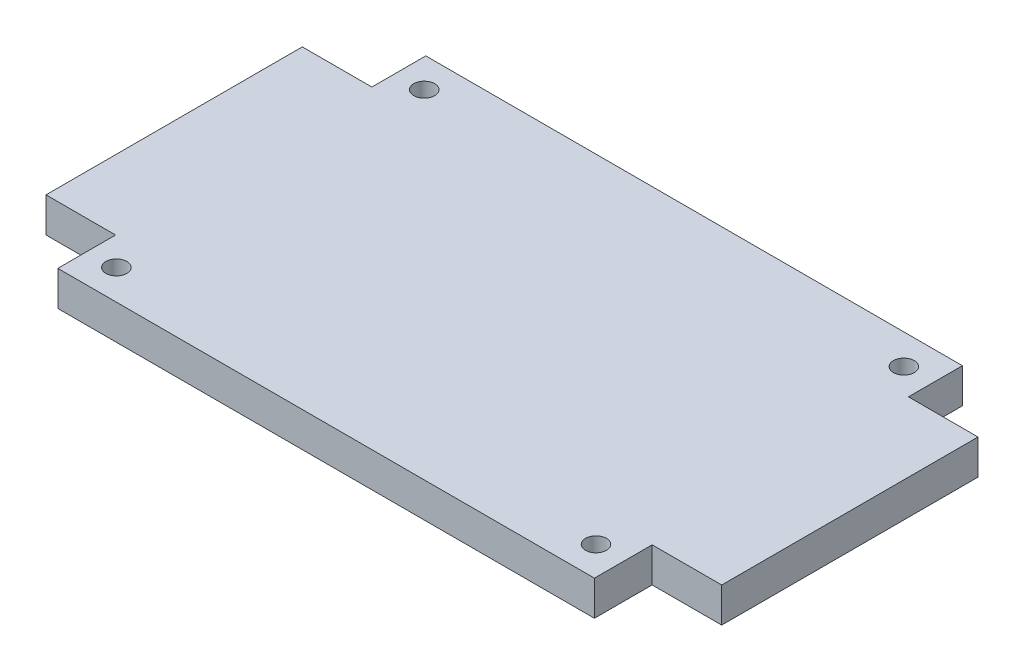
ISO-10303-21;
HEADER;
FILE_DESCRIPTION(('STEP AP214'),'2;1');
FILE_NAME('part.step','',(''),(''),'','','');
FILE_SCHEMA(('AUTOMOTIVE_DESIGN { 1 0 10303 214 1 1 1 1 }'));
ENDSEC;
DATA;
#1=APPLICATION_CONTEXT('core data for automotive mechanical design processes');
#2=APPLICATION_PROTOCOL_DEFINITION('international standard','automotive_design',2000,#1);
#3=PRODUCT_CONTEXT('',#1,'mechanical');
#4=PRODUCT('Part','Part','',(#3));
#5=PRODUCT_RELATED_PRODUCT_CATEGORY('part','',(#4));
#6=PRODUCT_DEFINITION_FORMATION('','',#4);
#7=PRODUCT_DEFINITION_CONTEXT('part definition',#1,'design');
#8=PRODUCT_DEFINITION('design','',#6,#7);
#9=PRODUCT_DEFINITION_SHAPE('','',#8);
#10=(LENGTH_UNIT() NAMED_UNIT(*) SI_UNIT(.MILLI.,.METRE.));
#11=(NAMED_UNIT(*) PLANE_ANGLE_UNIT() SI_UNIT($,.RADIAN.));
#12=(NAMED_UNIT(*) SI_UNIT($,.STERADIAN.) SOLID_ANGLE_UNIT());
#13=UNCERTAINTY_MEASURE_WITH_UNIT(LENGTH_MEASURE(1.E-05),#10,'distance_accuracy_value','');
#14=(GEOMETRIC_REPRESENTATION_CONTEXT(3) GLOBAL_UNCERTAINTY_ASSIGNED_CONTEXT((#13)) GLOBAL_UNIT_ASSIGNED_CONTEXT((#10,
#11,#12)) REPRESENTATION_CONTEXT('',''));
#15=CARTESIAN_POINT('',(0.,0.,0.));
#16=DIRECTION('',(0.,0.,1.));
#17=DIRECTION('',(1.,0.,0.));
#18=AXIS2_PLACEMENT_3D('',#15,#16,#17);
#19=CARTESIAN_POINT('',(38.57,5.,26.45));
#20=DIRECTION('',(-1.,0.,0.));
#21=DIRECTION('',(0.,0.,1.));
#22=AXIS2_PLACEMENT_3D('',#19,#20,#21);
#23=PLANE('',#22);
#24=DIRECTION('',(0.,0.,-1.));
#25=VECTOR('',#24,1.);
#26=CARTESIAN_POINT('',(38.57,5.,26.45));
#27=LINE('',#26,#25);
#28=CARTESIAN_POINT('',(38.57,5.,-18.6946871989676));
#29=VERTEX_POINT('',#28);
#30=CARTESIAN_POINT('',(38.57,5.,-26.45));
#31=VERTEX_POINT('',#30);
#32=EDGE_CURVE('E222',#29,#31,#27,.T.);
#33=ORIENTED_EDGE('',*,*,#32,.F.);
#34=DIRECTION('',(0.,-1.,0.));
#35=VECTOR('',#34,1.);
#36=CARTESIAN_POINT('',(38.57,5.,-18.6946871989676));
#37=LINE('',#36,#35);
#38=CARTESIAN_POINT('',(38.57,0.,-18.6946871989676));
#39=VERTEX_POINT('',#38);
#40=EDGE_CURVE('E138',#29,#39,#37,.T.);
#41=ORIENTED_EDGE('',*,*,#40,.T.);
#42=DIRECTION('',(0.,0.,-1.));
#43=VECTOR('',#42,1.);
#44=CARTESIAN_POINT('',(38.57,0.,26.45));
#45=LINE('',#44,#43);
#46=CARTESIAN_POINT('',(38.57,0.,-26.45));
#47=VERTEX_POINT('',#46);
#48=EDGE_CURVE('E232',#39,#47,#45,.T.);
#49=ORIENTED_EDGE('',*,*,#48,.T.);
#50=DIRECTION('',(0.,-1.,0.));
#51=VECTOR('',#50,1.);
#52=CARTESIAN_POINT('',(38.57,5.,-26.45));
#53=LINE('',#52,#51);
#54=EDGE_CURVE('E240',#31,#47,#53,.T.);
#55=ORIENTED_EDGE('',*,*,#54,.F.);
#56=EDGE_LOOP('',(#33,#41,#49,#55));
#57=FACE_BOUND('',#56,.T.);
#58=ADVANCED_FACE('F41',(#57),#23,.F.);
#59=CARTESIAN_POINT('',(-38.57,5.,26.45));
#60=DIRECTION('',(1.,0.,0.));
#61=DIRECTION('',(0.,0.,-1.));
#62=AXIS2_PLACEMENT_3D('',#59,#60,#61);
#63=PLANE('',#62);
#64=DIRECTION('',(0.,-1.,0.));
#65=VECTOR('',#64,1.);
#66=CARTESIAN_POINT('',(-38.57,5.,-18.6946871989676));
#67=LINE('',#66,#65);
#68=CARTESIAN_POINT('',(-38.57,5.,-18.6946871989676));
#69=VERTEX_POINT('',#68);
#70=CARTESIAN_POINT('',(-38.57,0.,-18.6946871989676));
#71=VERTEX_POINT('',#70);
#72=EDGE_CURVE('E64',#69,#71,#67,.T.);
#73=ORIENTED_EDGE('',*,*,#72,.F.);
#74=DIRECTION('',(0.,0.,1.));
#75=VECTOR('',#74,1.);
#76=CARTESIAN_POINT('',(-38.57,5.,26.45));
#77=LINE('',#76,#75);
#78=CARTESIAN_POINT('',(-38.57,5.,-26.45));
#79=VERTEX_POINT('',#78);
#80=EDGE_CURVE('E217',#79,#69,#77,.T.);
#81=ORIENTED_EDGE('',*,*,#80,.F.);
#82=DIRECTION('',(0.,-1.,0.));
#83=VECTOR('',#82,1.);
#84=CARTESIAN_POINT('',(-38.57,5.,-26.45));
#85=LINE('',#84,#83);
#86=CARTESIAN_POINT('',(-38.57,0.,-26.45));
#87=VERTEX_POINT('',#86);
#88=EDGE_CURVE('E227',#79,#87,#85,.T.);
#89=ORIENTED_EDGE('',*,*,#88,.T.);
#90=DIRECTION('',(0.,0.,1.));
#91=VECTOR('',#90,1.);
#92=CARTESIAN_POINT('',(-38.57,0.,26.45));
#93=LINE('',#92,#91);
#94=EDGE_CURVE('E228',#87,#71,#93,.T.);
#95=ORIENTED_EDGE('',*,*,#94,.T.);
#96=EDGE_LOOP('',(#73,#81,#89,#95));
#97=FACE_BOUND('',#96,.T.);
#98=ADVANCED_FACE('F43',(#97),#63,.F.);
#99=DIRECTION('',(0.,1.,0.));
#100=VECTOR('',#99,1.);
#101=CARTESIAN_POINT('',(-38.57,5.,18.1501817465705));
#102=LINE('',#101,#100);
#103=CARTESIAN_POINT('',(-38.57,0.,18.1501817465705));
#104=VERTEX_POINT('',#103);
#105=CARTESIAN_POINT('',(-38.57,5.,18.1501817465705));
#106=VERTEX_POINT('',#105);
#107=EDGE_CURVE('E171',#104,#106,#102,.T.);
#108=ORIENTED_EDGE('',*,*,#107,.F.);
#109=CARTESIAN_POINT('',(-38.57,0.,26.45));
#110=VERTEX_POINT('',#109);
#111=EDGE_CURVE('E214',#104,#110,#93,.T.);
#112=ORIENTED_EDGE('',*,*,#111,.T.);
#113=DIRECTION('',(0.,-1.,0.));
#114=VECTOR('',#113,1.);
#115=CARTESIAN_POINT('',(-38.57,5.,26.45));
#116=LINE('',#115,#114);
#117=CARTESIAN_POINT('',(-38.57,5.,26.45));
#118=VERTEX_POINT('',#117);
#119=EDGE_CURVE('E11',#118,#110,#116,.T.);
#120=ORIENTED_EDGE('',*,*,#119,.F.);
#121=EDGE_CURVE('E220',#106,#118,#77,.T.);
#122=ORIENTED_EDGE('',*,*,#121,.F.);
#123=EDGE_LOOP('',(#108,#112,#120,#122));
#124=FACE_BOUND('',#123,.T.);
#125=ADVANCED_FACE('F260',(#124),#63,.F.);
#126=CARTESIAN_POINT('',(0.,5.,0.));
#127=DIRECTION('',(0.,1.,0.));
#128=DIRECTION('',(0.,0.,1.));
#129=AXIS2_PLACEMENT_3D('',#126,#127,#128);
#130=PLANE('',#129);
#131=CARTESIAN_POINT('',(-34.475,5.,-22.13));
#132=DIRECTION('',(0.,1.,0.));
#133=DIRECTION('',(0.,0.,1.));
#134=AXIS2_PLACEMENT_3D('',#131,#132,#133);
#135=CIRCLE('',#134,1.5);
#136=CARTESIAN_POINT('',(-34.475,5.,-20.63));
#137=VERTEX_POINT('',#136);
#138=EDGE_CURVE('E199',#137,#137,#135,.T.);
#139=ORIENTED_EDGE('',*,*,#138,.F.);
#140=EDGE_LOOP('',(#139));
#141=FACE_BOUND('',#140,.T.);
#142=CARTESIAN_POINT('',(34.475,5.,22.13));
#143=DIRECTION('',(0.,1.,0.));
#144=DIRECTION('',(0.,0.,1.));
#145=AXIS2_PLACEMENT_3D('',#142,#143,#144);
#146=CIRCLE('',#145,1.5);
#147=CARTESIAN_POINT('',(34.475,5.,23.63));
#148=VERTEX_POINT('',#147);
#149=EDGE_CURVE('E211',#148,#148,#146,.T.);
#150=ORIENTED_EDGE('',*,*,#149,.F.);
#151=EDGE_LOOP('',(#150));
#152=FACE_BOUND('',#151,.T.);
#153=ORIENTED_EDGE('',*,*,#80,.T.);
#154=DIRECTION('',(1.,0.,0.));
#155=VECTOR('',#154,1.);
#156=CARTESIAN_POINT('',(-48.57,5.,-18.6946871989676));
#157=LINE('',#156,#155);
#158=CARTESIAN_POINT('',(-48.57,5.,-18.6946871989676));
#159=VERTEX_POINT('',#158);
#160=EDGE_CURVE('E177',#159,#69,#157,.T.);
#161=ORIENTED_EDGE('',*,*,#160,.F.);
#162=DIRECTION('',(0.,0.,-1.));
#163=VECTOR('',#162,1.);
#164=CARTESIAN_POINT('',(-48.57,5.,-18.6946871989676));
#165=LINE('',#164,#163);
#166=CARTESIAN_POINT('',(-48.57,5.,18.1501817465705));
#167=VERTEX_POINT('',#166);
#168=EDGE_CURVE('E175',#167,#159,#165,.T.);
#169=ORIENTED_EDGE('',*,*,#168,.F.);
#170=DIRECTION('',(1.,0.,0.));
#171=VECTOR('',#170,1.);
#172=CARTESIAN_POINT('',(-48.57,5.,18.1501817465705));
#173=LINE('',#172,#171);
#174=EDGE_CURVE('E183',#167,#106,#173,.T.);
#175=ORIENTED_EDGE('',*,*,#174,.T.);
#176=ORIENTED_EDGE('',*,*,#121,.T.);
#177=DIRECTION('',(1.,0.,0.));
#178=VECTOR('',#177,1.);
#179=CARTESIAN_POINT('',(38.57,5.,26.45));
#180=LINE('',#179,#178);
#181=CARTESIAN_POINT('',(38.57,5.,26.45));
#182=VERTEX_POINT('',#181);
#183=EDGE_CURVE('E219',#118,#182,#180,.T.);
#184=ORIENTED_EDGE('',*,*,#183,.T.);
#185=CARTESIAN_POINT('',(38.57,5.,18.1501817465705));
#186=VERTEX_POINT('',#185);
#187=EDGE_CURVE('E223',#182,#186,#27,.T.);
#188=ORIENTED_EDGE('',*,*,#187,.T.);
#189=DIRECTION('',(-1.,0.,0.));
#190=VECTOR('',#189,1.);
#191=CARTESIAN_POINT('',(48.57,5.,18.1501817465705));
#192=LINE('',#191,#190);
#193=CARTESIAN_POINT('',(48.57,5.,18.1501817465705));
#194=VERTEX_POINT('',#193);
#195=EDGE_CURVE('E56',#194,#186,#192,.T.);
#196=ORIENTED_EDGE('',*,*,#195,.F.);
#197=DIRECTION('',(0.,0.,-1.));
#198=VECTOR('',#197,1.);
#199=CARTESIAN_POINT('',(48.57,5.,-18.6946871989676));
#200=LINE('',#199,#198);
#201=CARTESIAN_POINT('',(48.57,5.,-18.6946871989676));
#202=VERTEX_POINT('',#201);
#203=EDGE_CURVE('E147',#194,#202,#200,.T.);
#204=ORIENTED_EDGE('',*,*,#203,.T.);
#205=DIRECTION('',(-1.,0.,0.));
#206=VECTOR('',#205,1.);
#207=CARTESIAN_POINT('',(48.57,5.,-18.6946871989676));
#208=LINE('',#207,#206);
#209=EDGE_CURVE('E132',#202,#29,#208,.T.);
#210=ORIENTED_EDGE('',*,*,#209,.T.);
#211=ORIENTED_EDGE('',*,*,#32,.T.);
#212=DIRECTION('',(-1.,0.,0.));
#213=VECTOR('',#212,1.);
#214=CARTESIAN_POINT('',(38.57,5.,-26.45));
#215=LINE('',#214,#213);
#216=EDGE_CURVE('E225',#31,#79,#215,.T.);
#217=ORIENTED_EDGE('',*,*,#216,.T.);
#218=EDGE_LOOP('',(#153,#161,#169,#175,#176,#184,#188,#196,#204,#210,#211,#217));
#219=FACE_BOUND('',#218,.T.);
#220=CARTESIAN_POINT('',(34.475,5.,-22.13));
#221=DIRECTION('',(0.,1.,0.));
#222=DIRECTION('',(0.,0.,1.));
#223=AXIS2_PLACEMENT_3D('',#220,#221,#222);
#224=CIRCLE('',#223,1.5);
#225=CARTESIAN_POINT('',(34.475,5.,-20.63));
#226=VERTEX_POINT('',#225);
#227=EDGE_CURVE('E205',#226,#226,#224,.T.);
#228=ORIENTED_EDGE('',*,*,#227,.F.);
#229=EDGE_LOOP('',(#228));
#230=FACE_BOUND('',#229,.T.);
#231=CARTESIAN_POINT('',(-34.475,5.,22.13));
#232=DIRECTION('',(0.,1.,0.));
#233=DIRECTION('',(0.,0.,1.));
#234=AXIS2_PLACEMENT_3D('',#231,#232,#233);
#235=CIRCLE('',#234,1.5);
#236=CARTESIAN_POINT('',(-34.475,5.,23.63));
#237=VERTEX_POINT('',#236);
#238=EDGE_CURVE('E193',#237,#237,#235,.T.);
#239=ORIENTED_EDGE('',*,*,#238,.F.);
#240=EDGE_LOOP('',(#239));
#241=FACE_BOUND('',#240,.T.);
#242=ADVANCED_FACE('F152',(#141,#152,#219,#230,#241),#130,.T.);
#243=CARTESIAN_POINT('',(0.,0.,0.));
#244=DIRECTION('',(0.,1.,0.));
#245=DIRECTION('',(0.,0.,1.));
#246=AXIS2_PLACEMENT_3D('',#243,#244,#245);
#247=PLANE('',#246);
#248=ORIENTED_EDGE('',*,*,#94,.F.);
#249=DIRECTION('',(-1.,0.,0.));
#250=VECTOR('',#249,1.);
#251=CARTESIAN_POINT('',(38.57,0.,-26.45));
#252=LINE('',#251,#250);
#253=EDGE_CURVE('E236',#47,#87,#252,.T.);
#254=ORIENTED_EDGE('',*,*,#253,.F.);
#255=ORIENTED_EDGE('',*,*,#48,.F.);
#256=DIRECTION('',(-1.,0.,0.));
#257=VECTOR('',#256,1.);
#258=CARTESIAN_POINT('',(48.57,0.,-18.6946871989676));
#259=LINE('',#258,#257);
#260=CARTESIAN_POINT('',(48.57,0.,-18.6946871989676));
#261=VERTEX_POINT('',#260);
#262=EDGE_CURVE('E160',#261,#39,#259,.T.);
#263=ORIENTED_EDGE('',*,*,#262,.F.);
#264=DIRECTION('',(0.,0.,1.));
#265=VECTOR('',#264,1.);
#266=CARTESIAN_POINT('',(48.57,0.,-18.6946871989676));
#267=LINE('',#266,#265);
#268=CARTESIAN_POINT('',(48.57,0.,18.1501817465705));
#269=VERTEX_POINT('',#268);
#270=EDGE_CURVE('E149',#261,#269,#267,.T.);
#271=ORIENTED_EDGE('',*,*,#270,.T.);
#272=DIRECTION('',(-1.,0.,0.));
#273=VECTOR('',#272,1.);
#274=CARTESIAN_POINT('',(48.57,0.,18.1501817465705));
#275=LINE('',#274,#273);
#276=CARTESIAN_POINT('',(38.57,0.,18.1501817465705));
#277=VERTEX_POINT('',#276);
#278=EDGE_CURVE('E164',#269,#277,#275,.T.);
#279=ORIENTED_EDGE('',*,*,#278,.T.);
#280=CARTESIAN_POINT('',(38.57,0.,26.45));
#281=VERTEX_POINT('',#280);
#282=EDGE_CURVE('E233',#281,#277,#45,.T.);
#283=ORIENTED_EDGE('',*,*,#282,.F.);
#284=DIRECTION('',(1.,0.,0.));
#285=VECTOR('',#284,1.);
#286=CARTESIAN_POINT('',(38.57,0.,26.45));
#287=LINE('',#286,#285);
#288=EDGE_CURVE('E230',#110,#281,#287,.T.);
#289=ORIENTED_EDGE('',*,*,#288,.F.);
#290=ORIENTED_EDGE('',*,*,#111,.F.);
#291=DIRECTION('',(1.,0.,0.));
#292=VECTOR('',#291,1.);
#293=CARTESIAN_POINT('',(-48.57,0.,18.1501817465705));
#294=LINE('',#293,#292);
#295=CARTESIAN_POINT('',(-48.57,0.,18.1501817465705));
#296=VERTEX_POINT('',#295);
#297=EDGE_CURVE('E186',#296,#104,#294,.T.);
#298=ORIENTED_EDGE('',*,*,#297,.F.);
#299=DIRECTION('',(0.,0.,1.));
#300=VECTOR('',#299,1.);
#301=CARTESIAN_POINT('',(-48.57,0.,-18.6946871989676));
#302=LINE('',#301,#300);
#303=CARTESIAN_POINT('',(-48.57,0.,-18.6946871989676));
#304=VERTEX_POINT('',#303);
#305=EDGE_CURVE('E170',#304,#296,#302,.T.);
#306=ORIENTED_EDGE('',*,*,#305,.F.);
#307=DIRECTION('',(1.,0.,0.));
#308=VECTOR('',#307,1.);
#309=CARTESIAN_POINT('',(-48.57,0.,-18.6946871989676));
#310=LINE('',#309,#308);
#311=EDGE_CURVE('E189',#304,#71,#310,.T.);
#312=ORIENTED_EDGE('',*,*,#311,.T.);
#313=EDGE_LOOP('',(#248,#254,#255,#263,#271,#279,#283,#289,#290,#298,#306,#312));
#314=FACE_BOUND('',#313,.T.);
#315=CARTESIAN_POINT('',(34.475,0.,22.13));
#316=DIRECTION('',(0.,1.,0.));
#317=DIRECTION('',(0.,0.,1.));
#318=AXIS2_PLACEMENT_3D('',#315,#316,#317);
#319=CIRCLE('',#318,1.5);
#320=CARTESIAN_POINT('',(34.475,0.,23.63));
#321=VERTEX_POINT('',#320);
#322=EDGE_CURVE('E208',#321,#321,#319,.T.);
#323=ORIENTED_EDGE('',*,*,#322,.T.);
#324=EDGE_LOOP('',(#323));
#325=FACE_BOUND('',#324,.T.);
#326=CARTESIAN_POINT('',(34.475,0.,-22.13));
#327=DIRECTION('',(0.,1.,0.));
#328=DIRECTION('',(0.,0.,1.));
#329=AXIS2_PLACEMENT_3D('',#326,#327,#328);
#330=CIRCLE('',#329,1.5);
#331=CARTESIAN_POINT('',(34.475,0.,-20.63));
#332=VERTEX_POINT('',#331);
#333=EDGE_CURVE('E202',#332,#332,#330,.T.);
#334=ORIENTED_EDGE('',*,*,#333,.T.);
#335=EDGE_LOOP('',(#334));
#336=FACE_BOUND('',#335,.T.);
#337=CARTESIAN_POINT('',(-34.475,0.,-22.13));
#338=DIRECTION('',(0.,1.,0.));
#339=DIRECTION('',(0.,0.,1.));
#340=AXIS2_PLACEMENT_3D('',#337,#338,#339);
#341=CIRCLE('',#340,1.5);
#342=CARTESIAN_POINT('',(-34.475,0.,-20.63));
#343=VERTEX_POINT('',#342);
#344=EDGE_CURVE('E196',#343,#343,#341,.T.);
#345=ORIENTED_EDGE('',*,*,#344,.T.);
#346=EDGE_LOOP('',(#345));
#347=FACE_BOUND('',#346,.T.);
#348=CARTESIAN_POINT('',(-34.475,0.,22.13));
#349=DIRECTION('',(0.,1.,0.));
#350=DIRECTION('',(0.,0.,1.));
#351=AXIS2_PLACEMENT_3D('',#348,#349,#350);
#352=CIRCLE('',#351,1.5);
#353=CARTESIAN_POINT('',(-34.475,0.,23.63));
#354=VERTEX_POINT('',#353);
#355=EDGE_CURVE('E192',#354,#354,#352,.T.);
#356=ORIENTED_EDGE('',*,*,#355,.T.);
#357=EDGE_LOOP('',(#356));
#358=FACE_BOUND('',#357,.T.);
#359=ADVANCED_FACE('F253',(#314,#325,#336,#347,#358),#247,.F.);
#360=CARTESIAN_POINT('',(38.57,5.,26.45));
#361=DIRECTION('',(0.,0.,-1.));
#362=DIRECTION('',(-1.,0.,0.));
#363=AXIS2_PLACEMENT_3D('',#360,#361,#362);
#364=PLANE('',#363);
#365=ORIENTED_EDGE('',*,*,#288,.T.);
#366=DIRECTION('',(0.,-1.,0.));
#367=VECTOR('',#366,1.);
#368=CARTESIAN_POINT('',(38.57,5.,26.45));
#369=LINE('',#368,#367);
#370=EDGE_CURVE('E49',#182,#281,#369,.T.);
#371=ORIENTED_EDGE('',*,*,#370,.F.);
#372=ORIENTED_EDGE('',*,*,#183,.F.);
#373=ORIENTED_EDGE('',*,*,#119,.T.);
#374=EDGE_LOOP('',(#365,#371,#372,#373));
#375=FACE_BOUND('',#374,.T.);
#376=ADVANCED_FACE('F258',(#375),#364,.F.);
#377=ORIENTED_EDGE('',*,*,#282,.T.);
#378=DIRECTION('',(0.,1.,0.));
#379=VECTOR('',#378,1.);
#380=CARTESIAN_POINT('',(38.57,5.,18.1501817465705));
#381=LINE('',#380,#379);
#382=EDGE_CURVE('E150',#277,#186,#381,.T.);
#383=ORIENTED_EDGE('',*,*,#382,.T.);
#384=ORIENTED_EDGE('',*,*,#187,.F.);
#385=ORIENTED_EDGE('',*,*,#370,.T.);
#386=EDGE_LOOP('',(#377,#383,#384,#385));
#387=FACE_BOUND('',#386,.T.);
#388=ADVANCED_FACE('F247',(#387),#23,.F.);
#389=CARTESIAN_POINT('',(38.57,5.,-26.45));
#390=DIRECTION('',(0.,0.,1.));
#391=DIRECTION('',(1.,0.,0.));
#392=AXIS2_PLACEMENT_3D('',#389,#390,#391);
#393=PLANE('',#392);
#394=ORIENTED_EDGE('',*,*,#253,.T.);
#395=ORIENTED_EDGE('',*,*,#88,.F.);
#396=ORIENTED_EDGE('',*,*,#216,.F.);
#397=ORIENTED_EDGE('',*,*,#54,.T.);
#398=EDGE_LOOP('',(#394,#395,#396,#397));
#399=FACE_BOUND('',#398,.T.);
#400=ADVANCED_FACE('F278',(#399),#393,.F.);
#401=CARTESIAN_POINT('',(34.475,5.,22.13));
#402=DIRECTION('',(0.,-1.,0.));
#403=DIRECTION('',(0.,0.,-1.));
#404=AXIS2_PLACEMENT_3D('',#401,#402,#403);
#405=CYLINDRICAL_SURFACE('',#404,1.5);
#406=ORIENTED_EDGE('',*,*,#149,.T.);
#407=EDGE_LOOP('',(#406));
#408=FACE_BOUND('',#407,.T.);
#409=ORIENTED_EDGE('',*,*,#322,.F.);
#410=EDGE_LOOP('',(#409));
#411=FACE_BOUND('',#410,.T.);
#412=ADVANCED_FACE('F296',(#408,#411),#405,.F.);
#413=CARTESIAN_POINT('',(34.475,5.,-22.13));
#414=DIRECTION('',(0.,-1.,0.));
#415=DIRECTION('',(0.,0.,-1.));
#416=AXIS2_PLACEMENT_3D('',#413,#414,#415);
#417=CYLINDRICAL_SURFACE('',#416,1.5);
#418=ORIENTED_EDGE('',*,*,#227,.T.);
#419=EDGE_LOOP('',(#418));
#420=FACE_BOUND('',#419,.T.);
#421=ORIENTED_EDGE('',*,*,#333,.F.);
#422=EDGE_LOOP('',(#421));
#423=FACE_BOUND('',#422,.T.);
#424=ADVANCED_FACE('F308',(#420,#423),#417,.F.);
#425=CARTESIAN_POINT('',(-34.475,5.,-22.13));
#426=DIRECTION('',(0.,-1.,0.));
#427=DIRECTION('',(0.,0.,-1.));
#428=AXIS2_PLACEMENT_3D('',#425,#426,#427);
#429=CYLINDRICAL_SURFACE('',#428,1.5);
#430=ORIENTED_EDGE('',*,*,#138,.T.);
#431=EDGE_LOOP('',(#430));
#432=FACE_BOUND('',#431,.T.);
#433=ORIENTED_EDGE('',*,*,#344,.F.);
#434=EDGE_LOOP('',(#433));
#435=FACE_BOUND('',#434,.T.);
#436=ADVANCED_FACE('F312',(#432,#435),#429,.F.);
#437=CARTESIAN_POINT('',(-34.475,5.,22.13));
#438=DIRECTION('',(0.,-1.,0.));
#439=DIRECTION('',(0.,0.,-1.));
#440=AXIS2_PLACEMENT_3D('',#437,#438,#439);
#441=CYLINDRICAL_SURFACE('',#440,1.5);
#442=ORIENTED_EDGE('',*,*,#238,.T.);
#443=EDGE_LOOP('',(#442));
#444=FACE_BOUND('',#443,.T.);
#445=ORIENTED_EDGE('',*,*,#355,.F.);
#446=EDGE_LOOP('',(#445));
#447=FACE_BOUND('',#446,.T.);
#448=ADVANCED_FACE('F316',(#444,#447),#441,.F.);
#449=CARTESIAN_POINT('',(-48.57,5.,-18.6946871989676));
#450=DIRECTION('',(0.,0.,1.));
#451=DIRECTION('',(1.,0.,0.));
#452=AXIS2_PLACEMENT_3D('',#449,#450,#451);
#453=PLANE('',#452);
#454=ORIENTED_EDGE('',*,*,#72,.T.);
#455=ORIENTED_EDGE('',*,*,#311,.F.);
#456=DIRECTION('',(0.,-1.,0.));
#457=VECTOR('',#456,1.);
#458=CARTESIAN_POINT('',(-48.57,5.,-18.6946871989676));
#459=LINE('',#458,#457);
#460=EDGE_CURVE('E167',#159,#304,#459,.T.);
#461=ORIENTED_EDGE('',*,*,#460,.F.);
#462=ORIENTED_EDGE('',*,*,#160,.T.);
#463=EDGE_LOOP('',(#454,#455,#461,#462));
#464=FACE_BOUND('',#463,.T.);
#465=ADVANCED_FACE('F274',(#464),#453,.F.);
#466=CARTESIAN_POINT('',(-48.57,5.,18.1501817465705));
#467=DIRECTION('',(0.,0.,-1.));
#468=DIRECTION('',(-1.,0.,0.));
#469=AXIS2_PLACEMENT_3D('',#466,#467,#468);
#470=PLANE('',#469);
#471=ORIENTED_EDGE('',*,*,#107,.T.);
#472=ORIENTED_EDGE('',*,*,#174,.F.);
#473=DIRECTION('',(0.,1.,0.));
#474=VECTOR('',#473,1.);
#475=CARTESIAN_POINT('',(-48.57,5.,18.1501817465705));
#476=LINE('',#475,#474);
#477=EDGE_CURVE('E173',#296,#167,#476,.T.);
#478=ORIENTED_EDGE('',*,*,#477,.F.);
#479=ORIENTED_EDGE('',*,*,#297,.T.);
#480=EDGE_LOOP('',(#471,#472,#478,#479));
#481=FACE_BOUND('',#480,.T.);
#482=ADVANCED_FACE('F264',(#481),#470,.F.);
#483=CARTESIAN_POINT('',(-48.57,0.,0.));
#484=DIRECTION('',(-1.,0.,0.));
#485=DIRECTION('',(0.,0.,1.));
#486=AXIS2_PLACEMENT_3D('',#483,#484,#485);
#487=PLANE('',#486);
#488=ORIENTED_EDGE('',*,*,#460,.T.);
#489=ORIENTED_EDGE('',*,*,#305,.T.);
#490=ORIENTED_EDGE('',*,*,#477,.T.);
#491=ORIENTED_EDGE('',*,*,#168,.T.);
#492=EDGE_LOOP('',(#488,#489,#490,#491));
#493=FACE_BOUND('',#492,.T.);
#494=ADVANCED_FACE('F268',(#493),#487,.T.);
#495=CARTESIAN_POINT('',(48.57,5.,-18.6946871989676));
#496=DIRECTION('',(0.,0.,-1.));
#497=DIRECTION('',(-1.,0.,0.));
#498=AXIS2_PLACEMENT_3D('',#495,#496,#497);
#499=PLANE('',#498);
#500=ORIENTED_EDGE('',*,*,#40,.F.);
#501=ORIENTED_EDGE('',*,*,#209,.F.);
#502=DIRECTION('',(0.,-1.,0.));
#503=VECTOR('',#502,1.);
#504=CARTESIAN_POINT('',(48.57,5.,-18.6946871989676));
#505=LINE('',#504,#503);
#506=EDGE_CURVE('E135',#202,#261,#505,.T.);
#507=ORIENTED_EDGE('',*,*,#506,.T.);
#508=ORIENTED_EDGE('',*,*,#262,.T.);
#509=EDGE_LOOP('',(#500,#501,#507,#508));
#510=FACE_BOUND('',#509,.T.);
#511=ADVANCED_FACE('F134',(#510),#499,.T.);
#512=CARTESIAN_POINT('',(48.57,5.,18.1501817465705));
#513=DIRECTION('',(0.,0.,1.));
#514=DIRECTION('',(1.,0.,0.));
#515=AXIS2_PLACEMENT_3D('',#512,#513,#514);
#516=PLANE('',#515);
#517=ORIENTED_EDGE('',*,*,#382,.F.);
#518=ORIENTED_EDGE('',*,*,#278,.F.);
#519=DIRECTION('',(0.,1.,0.));
#520=VECTOR('',#519,1.);
#521=CARTESIAN_POINT('',(48.57,5.,18.1501817465705));
#522=LINE('',#521,#520);
#523=EDGE_CURVE('E155',#269,#194,#522,.T.);
#524=ORIENTED_EDGE('',*,*,#523,.T.);
#525=ORIENTED_EDGE('',*,*,#195,.T.);
#526=EDGE_LOOP('',(#517,#518,#524,#525));
#527=FACE_BOUND('',#526,.T.);
#528=ADVANCED_FACE('F256',(#527),#516,.T.);
#529=CARTESIAN_POINT('',(48.57,0.,0.));
#530=DIRECTION('',(1.,0.,0.));
#531=DIRECTION('',(0.,0.,1.));
#532=AXIS2_PLACEMENT_3D('',#529,#530,#531);
#533=PLANE('',#532);
#534=ORIENTED_EDGE('',*,*,#506,.F.);
#535=ORIENTED_EDGE('',*,*,#203,.F.);
#536=ORIENTED_EDGE('',*,*,#523,.F.);
#537=ORIENTED_EDGE('',*,*,#270,.F.);
#538=EDGE_LOOP('',(#534,#535,#536,#537));
#539=FACE_BOUND('',#538,.T.);
#540=ADVANCED_FACE('F145',(#539),#533,.T.);
#541=CLOSED_SHELL('',(#58,#98,#125,#242,#359,#376,#388,#400,#412,#424,#436,#448,#465,#482,#494,
#511,#528,#540));
#542=MANIFOLD_SOLID_BREP('B2',#541);
#543=ADVANCED_BREP_SHAPE_REPRESENTATION('',(#18,#542),#14);
#544=SHAPE_DEFINITION_REPRESENTATION(#9,#543);
ENDSEC;
END-ISO-10303-21;
